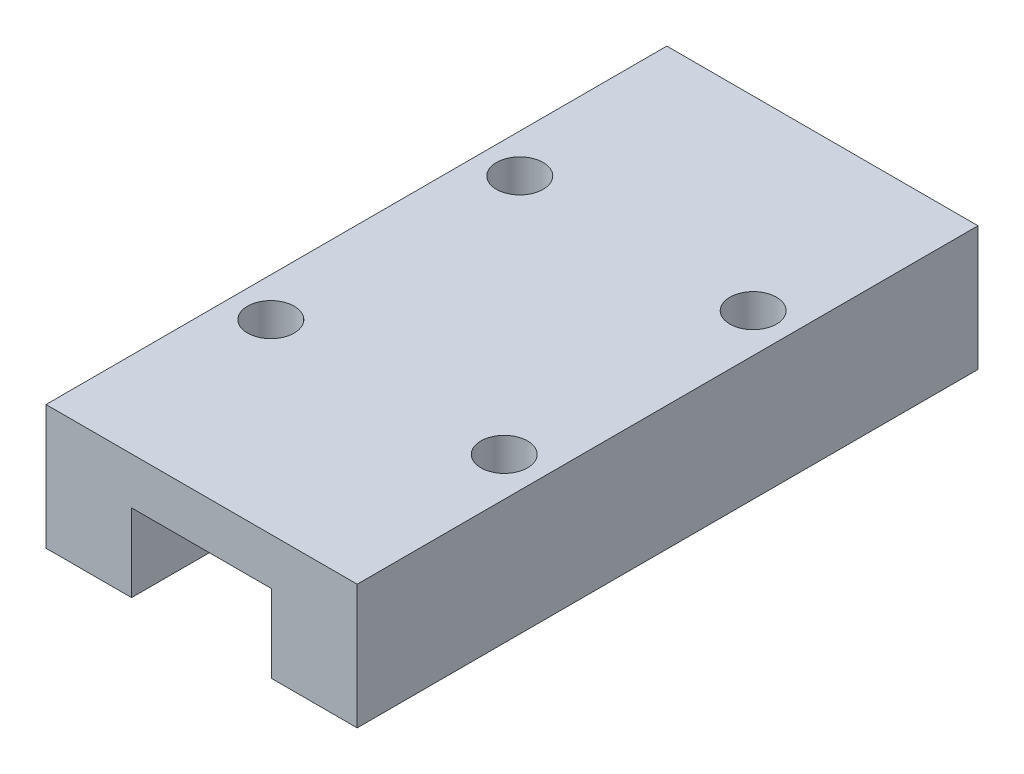
ISO-10303-21;
HEADER;
FILE_DESCRIPTION(('STEP AP214'),'2;1');
FILE_NAME('part.step','',(''),(''),'','','');
FILE_SCHEMA(('AUTOMOTIVE_DESIGN { 1 0 10303 214 1 1 1 1 }'));
ENDSEC;
DATA;
#1=APPLICATION_CONTEXT('core data for automotive mechanical design processes');
#2=APPLICATION_PROTOCOL_DEFINITION('international standard','automotive_design',2000,#1);
#3=PRODUCT_CONTEXT('',#1,'mechanical');
#4=PRODUCT('Part','Part','',(#3));
#5=PRODUCT_RELATED_PRODUCT_CATEGORY('part','',(#4));
#6=PRODUCT_DEFINITION_FORMATION('','',#4);
#7=PRODUCT_DEFINITION_CONTEXT('part definition',#1,'design');
#8=PRODUCT_DEFINITION('design','',#6,#7);
#9=PRODUCT_DEFINITION_SHAPE('','',#8);
#10=(LENGTH_UNIT() NAMED_UNIT(*) SI_UNIT(.MILLI.,.METRE.));
#11=(NAMED_UNIT(*) PLANE_ANGLE_UNIT() SI_UNIT($,.RADIAN.));
#12=(NAMED_UNIT(*) SI_UNIT($,.STERADIAN.) SOLID_ANGLE_UNIT());
#13=UNCERTAINTY_MEASURE_WITH_UNIT(LENGTH_MEASURE(1.E-05),#10,'distance_accuracy_value','');
#14=(GEOMETRIC_REPRESENTATION_CONTEXT(3) GLOBAL_UNCERTAINTY_ASSIGNED_CONTEXT((#13)) GLOBAL_UNIT_ASSIGNED_CONTEXT((#10,
#11,#12)) REPRESENTATION_CONTEXT('',''));
#15=CARTESIAN_POINT('',(0.,0.,0.));
#16=DIRECTION('',(0.,0.,1.));
#17=DIRECTION('',(1.,0.,0.));
#18=AXIS2_PLACEMENT_3D('',#15,#16,#17);
#19=CARTESIAN_POINT('',(0.,0.,39.9));
#20=DIRECTION('',(-1.,0.,0.));
#21=DIRECTION('',(0.,-1.,0.));
#22=AXIS2_PLACEMENT_3D('',#19,#20,#21);
#23=PLANE('',#22);
#24=DIRECTION('',(0.,1.,0.));
#25=VECTOR('',#24,1.);
#26=CARTESIAN_POINT('',(0.,0.,0.));
#27=LINE('',#26,#25);
#28=CARTESIAN_POINT('',(0.,0.,0.));
#29=VERTEX_POINT('',#28);
#30=CARTESIAN_POINT('',(0.,8.,0.));
#31=VERTEX_POINT('',#30);
#32=EDGE_CURVE('E130',#29,#31,#27,.T.);
#33=ORIENTED_EDGE('',*,*,#32,.T.);
#34=DIRECTION('',(0.,0.,-1.));
#35=VECTOR('',#34,1.);
#36=CARTESIAN_POINT('',(0.,8.,39.9));
#37=LINE('',#36,#35);
#38=CARTESIAN_POINT('',(0.,8.,39.9));
#39=VERTEX_POINT('',#38);
#40=EDGE_CURVE('E11',#39,#31,#37,.T.);
#41=ORIENTED_EDGE('',*,*,#40,.F.);
#42=DIRECTION('',(0.,1.,0.));
#43=VECTOR('',#42,1.);
#44=CARTESIAN_POINT('',(0.,0.,39.9));
#45=LINE('',#44,#43);
#46=CARTESIAN_POINT('',(0.,0.,39.9));
#47=VERTEX_POINT('',#46);
#48=EDGE_CURVE('E145',#47,#39,#45,.T.);
#49=ORIENTED_EDGE('',*,*,#48,.F.);
#50=DIRECTION('',(0.,0.,-1.));
#51=VECTOR('',#50,1.);
#52=CARTESIAN_POINT('',(0.,0.,39.9));
#53=LINE('',#52,#51);
#54=EDGE_CURVE('E126',#47,#29,#53,.T.);
#55=ORIENTED_EDGE('',*,*,#54,.T.);
#56=EDGE_LOOP('',(#33,#41,#49,#55));
#57=FACE_BOUND('',#56,.T.);
#58=ADVANCED_FACE('F34',(#57),#23,.F.);
#59=CARTESIAN_POINT('',(0.,8.,39.9));
#60=DIRECTION('',(0.,-1.,0.));
#61=DIRECTION('',(1.,0.,0.));
#62=AXIS2_PLACEMENT_3D('',#59,#60,#61);
#63=PLANE('',#62);
#64=CARTESIAN_POINT('',(-17.5,8.,27.95));
#65=DIRECTION('',(0.,1.,0.));
#66=DIRECTION('',(1.,0.,0.));
#67=AXIS2_PLACEMENT_3D('',#64,#65,#66);
#68=CIRCLE('',#67,1.5);
#69=CARTESIAN_POINT('',(-16.,8.,27.95));
#70=VERTEX_POINT('',#69);
#71=EDGE_CURVE('E196',#70,#70,#68,.T.);
#72=ORIENTED_EDGE('',*,*,#71,.F.);
#73=EDGE_LOOP('',(#72));
#74=FACE_BOUND('',#73,.T.);
#75=CARTESIAN_POINT('',(-2.5,8.,27.95));
#76=DIRECTION('',(0.,1.,0.));
#77=DIRECTION('',(-1.,0.,0.));
#78=AXIS2_PLACEMENT_3D('',#75,#76,#77);
#79=CIRCLE('',#78,1.5);
#80=CARTESIAN_POINT('',(-4.,8.,27.95));
#81=VERTEX_POINT('',#80);
#82=EDGE_CURVE('E190',#81,#81,#79,.T.);
#83=ORIENTED_EDGE('',*,*,#82,.F.);
#84=EDGE_LOOP('',(#83));
#85=FACE_BOUND('',#84,.T.);
#86=CARTESIAN_POINT('',(-2.5,8.,11.95));
#87=DIRECTION('',(0.,1.,0.));
#88=DIRECTION('',(1.,0.,0.));
#89=AXIS2_PLACEMENT_3D('',#86,#87,#88);
#90=CIRCLE('',#89,1.5);
#91=CARTESIAN_POINT('',(-1.,8.,11.95));
#92=VERTEX_POINT('',#91);
#93=EDGE_CURVE('E184',#92,#92,#90,.T.);
#94=ORIENTED_EDGE('',*,*,#93,.F.);
#95=EDGE_LOOP('',(#94));
#96=FACE_BOUND('',#95,.T.);
#97=CARTESIAN_POINT('',(-17.5,8.,11.95));
#98=DIRECTION('',(0.,1.,0.));
#99=DIRECTION('',(-1.,0.,0.));
#100=AXIS2_PLACEMENT_3D('',#97,#98,#99);
#101=CIRCLE('',#100,1.5);
#102=CARTESIAN_POINT('',(-19.,8.,11.95));
#103=VERTEX_POINT('',#102);
#104=EDGE_CURVE('E178',#103,#103,#101,.T.);
#105=ORIENTED_EDGE('',*,*,#104,.F.);
#106=EDGE_LOOP('',(#105));
#107=FACE_BOUND('',#106,.T.);
#108=DIRECTION('',(-1.,0.,0.));
#109=VECTOR('',#108,1.);
#110=CARTESIAN_POINT('',(0.,8.,0.));
#111=LINE('',#110,#109);
#112=CARTESIAN_POINT('',(-20.,8.,0.));
#113=VERTEX_POINT('',#112);
#114=EDGE_CURVE('E133',#31,#113,#111,.T.);
#115=ORIENTED_EDGE('',*,*,#114,.T.);
#116=DIRECTION('',(0.,0.,-1.));
#117=VECTOR('',#116,1.);
#118=CARTESIAN_POINT('',(-20.,8.,39.9));
#119=LINE('',#118,#117);
#120=CARTESIAN_POINT('',(-20.,8.,39.9));
#121=VERTEX_POINT('',#120);
#122=EDGE_CURVE('E42',#121,#113,#119,.T.);
#123=ORIENTED_EDGE('',*,*,#122,.F.);
#124=DIRECTION('',(-1.,0.,0.));
#125=VECTOR('',#124,1.);
#126=CARTESIAN_POINT('',(0.,8.,39.9));
#127=LINE('',#126,#125);
#128=EDGE_CURVE('E93',#39,#121,#127,.T.);
#129=ORIENTED_EDGE('',*,*,#128,.F.);
#130=ORIENTED_EDGE('',*,*,#40,.T.);
#131=EDGE_LOOP('',(#115,#123,#129,#130));
#132=FACE_BOUND('',#131,.T.);
#133=ADVANCED_FACE('F211',(#74,#85,#96,#107,#132),#63,.F.);
#134=CARTESIAN_POINT('',(-20.,0.,39.9));
#135=DIRECTION('',(1.,0.,0.));
#136=DIRECTION('',(0.,0.,-1.));
#137=AXIS2_PLACEMENT_3D('',#134,#135,#136);
#138=PLANE('',#137);
#139=DIRECTION('',(0.,-1.,0.));
#140=VECTOR('',#139,1.);
#141=CARTESIAN_POINT('',(-20.,0.,0.));
#142=LINE('',#141,#140);
#143=CARTESIAN_POINT('',(-20.,0.,0.));
#144=VERTEX_POINT('',#143);
#145=EDGE_CURVE('E136',#113,#144,#142,.T.);
#146=ORIENTED_EDGE('',*,*,#145,.T.);
#147=DIRECTION('',(0.,0.,-1.));
#148=VECTOR('',#147,1.);
#149=CARTESIAN_POINT('',(-20.,0.,39.9));
#150=LINE('',#149,#148);
#151=CARTESIAN_POINT('',(-20.,0.,39.9));
#152=VERTEX_POINT('',#151);
#153=EDGE_CURVE('E152',#152,#144,#150,.T.);
#154=ORIENTED_EDGE('',*,*,#153,.F.);
#155=DIRECTION('',(0.,-1.,0.));
#156=VECTOR('',#155,1.);
#157=CARTESIAN_POINT('',(-20.,0.,39.9));
#158=LINE('',#157,#156);
#159=EDGE_CURVE('E160',#121,#152,#158,.T.);
#160=ORIENTED_EDGE('',*,*,#159,.F.);
#161=ORIENTED_EDGE('',*,*,#122,.T.);
#162=EDGE_LOOP('',(#146,#154,#160,#161));
#163=FACE_BOUND('',#162,.T.);
#164=ADVANCED_FACE('F158',(#163),#138,.F.);
#165=CARTESIAN_POINT('',(-14.5,0.,39.9));
#166=DIRECTION('',(0.,1.,0.));
#167=DIRECTION('',(-1.,0.,0.));
#168=AXIS2_PLACEMENT_3D('',#165,#166,#167);
#169=PLANE('',#168);
#170=DIRECTION('',(1.,0.,0.));
#171=VECTOR('',#170,1.);
#172=CARTESIAN_POINT('',(-14.5,0.,0.));
#173=LINE('',#172,#171);
#174=CARTESIAN_POINT('',(-14.5,0.,0.));
#175=VERTEX_POINT('',#174);
#176=EDGE_CURVE('E138',#144,#175,#173,.T.);
#177=ORIENTED_EDGE('',*,*,#176,.T.);
#178=DIRECTION('',(0.,0.,-1.));
#179=VECTOR('',#178,1.);
#180=CARTESIAN_POINT('',(-14.5,0.,39.9));
#181=LINE('',#180,#179);
#182=CARTESIAN_POINT('',(-14.5,0.,39.9));
#183=VERTEX_POINT('',#182);
#184=EDGE_CURVE('E149',#183,#175,#181,.T.);
#185=ORIENTED_EDGE('',*,*,#184,.F.);
#186=DIRECTION('',(1.,0.,0.));
#187=VECTOR('',#186,1.);
#188=CARTESIAN_POINT('',(-14.5,0.,39.9));
#189=LINE('',#188,#187);
#190=EDGE_CURVE('E172',#152,#183,#189,.T.);
#191=ORIENTED_EDGE('',*,*,#190,.F.);
#192=ORIENTED_EDGE('',*,*,#153,.T.);
#193=EDGE_LOOP('',(#177,#185,#191,#192));
#194=FACE_BOUND('',#193,.T.);
#195=ADVANCED_FACE('F168',(#194),#169,.F.);
#196=CARTESIAN_POINT('',(-14.5,0.,39.9));
#197=DIRECTION('',(-1.,0.,0.));
#198=DIRECTION('',(0.,0.,1.));
#199=AXIS2_PLACEMENT_3D('',#196,#197,#198);
#200=PLANE('',#199);
#201=DIRECTION('',(0.,1.,0.));
#202=VECTOR('',#201,1.);
#203=CARTESIAN_POINT('',(-14.5,0.,0.));
#204=LINE('',#203,#202);
#205=CARTESIAN_POINT('',(-14.5,5.,0.));
#206=VERTEX_POINT('',#205);
#207=EDGE_CURVE('E140',#175,#206,#204,.T.);
#208=ORIENTED_EDGE('',*,*,#207,.T.);
#209=DIRECTION('',(0.,0.,-1.));
#210=VECTOR('',#209,1.);
#211=CARTESIAN_POINT('',(-14.5,5.,39.9));
#212=LINE('',#211,#210);
#213=CARTESIAN_POINT('',(-14.5,5.,39.9));
#214=VERTEX_POINT('',#213);
#215=EDGE_CURVE('E121',#214,#206,#212,.T.);
#216=ORIENTED_EDGE('',*,*,#215,.F.);
#217=DIRECTION('',(0.,1.,0.));
#218=VECTOR('',#217,1.);
#219=CARTESIAN_POINT('',(-14.5,0.,39.9));
#220=LINE('',#219,#218);
#221=EDGE_CURVE('E112',#183,#214,#220,.T.);
#222=ORIENTED_EDGE('',*,*,#221,.F.);
#223=ORIENTED_EDGE('',*,*,#184,.T.);
#224=EDGE_LOOP('',(#208,#216,#222,#223));
#225=FACE_BOUND('',#224,.T.);
#226=ADVANCED_FACE('F171',(#225),#200,.F.);
#227=CARTESIAN_POINT('',(-14.5,5.,39.9));
#228=DIRECTION('',(0.,1.,0.));
#229=DIRECTION('',(-1.,0.,0.));
#230=AXIS2_PLACEMENT_3D('',#227,#228,#229);
#231=PLANE('',#230);
#232=DIRECTION('',(1.,0.,0.));
#233=VECTOR('',#232,1.);
#234=CARTESIAN_POINT('',(-14.5,5.,0.));
#235=LINE('',#234,#233);
#236=CARTESIAN_POINT('',(-5.5,5.,0.));
#237=VERTEX_POINT('',#236);
#238=EDGE_CURVE('E120',#206,#237,#235,.T.);
#239=ORIENTED_EDGE('',*,*,#238,.T.);
#240=DIRECTION('',(0.,0.,-1.));
#241=VECTOR('',#240,1.);
#242=CARTESIAN_POINT('',(-5.5,5.,39.9));
#243=LINE('',#242,#241);
#244=CARTESIAN_POINT('',(-5.5,5.,39.9));
#245=VERTEX_POINT('',#244);
#246=EDGE_CURVE('E117',#245,#237,#243,.T.);
#247=ORIENTED_EDGE('',*,*,#246,.F.);
#248=DIRECTION('',(1.,0.,0.));
#249=VECTOR('',#248,1.);
#250=CARTESIAN_POINT('',(-14.5,5.,39.9));
#251=LINE('',#250,#249);
#252=EDGE_CURVE('E106',#214,#245,#251,.T.);
#253=ORIENTED_EDGE('',*,*,#252,.F.);
#254=ORIENTED_EDGE('',*,*,#215,.T.);
#255=EDGE_LOOP('',(#239,#247,#253,#254));
#256=FACE_BOUND('',#255,.T.);
#257=ADVANCED_FACE('F118',(#256),#231,.F.);
#258=CARTESIAN_POINT('',(-5.5,0.,39.9));
#259=DIRECTION('',(1.,0.,0.));
#260=DIRECTION('',(0.,1.,0.));
#261=AXIS2_PLACEMENT_3D('',#258,#259,#260);
#262=PLANE('',#261);
#263=DIRECTION('',(0.,-1.,0.));
#264=VECTOR('',#263,1.);
#265=CARTESIAN_POINT('',(-5.5,0.,0.));
#266=LINE('',#265,#264);
#267=CARTESIAN_POINT('',(-5.5,0.,0.));
#268=VERTEX_POINT('',#267);
#269=EDGE_CURVE('E79',#237,#268,#266,.T.);
#270=ORIENTED_EDGE('',*,*,#269,.T.);
#271=DIRECTION('',(0.,0.,-1.));
#272=VECTOR('',#271,1.);
#273=CARTESIAN_POINT('',(-5.5,0.,39.9));
#274=LINE('',#273,#272);
#275=CARTESIAN_POINT('',(-5.5,0.,39.9));
#276=VERTEX_POINT('',#275);
#277=EDGE_CURVE('E122',#276,#268,#274,.T.);
#278=ORIENTED_EDGE('',*,*,#277,.F.);
#279=DIRECTION('',(0.,-1.,0.));
#280=VECTOR('',#279,1.);
#281=CARTESIAN_POINT('',(-5.5,0.,39.9));
#282=LINE('',#281,#280);
#283=EDGE_CURVE('E110',#245,#276,#282,.T.);
#284=ORIENTED_EDGE('',*,*,#283,.F.);
#285=ORIENTED_EDGE('',*,*,#246,.T.);
#286=EDGE_LOOP('',(#270,#278,#284,#285));
#287=FACE_BOUND('',#286,.T.);
#288=ADVANCED_FACE('F124',(#287),#262,.F.);
#289=CARTESIAN_POINT('',(0.,0.,39.9));
#290=DIRECTION('',(0.,1.,0.));
#291=DIRECTION('',(-1.,0.,0.));
#292=AXIS2_PLACEMENT_3D('',#289,#290,#291);
#293=PLANE('',#292);
#294=DIRECTION('',(1.,0.,0.));
#295=VECTOR('',#294,1.);
#296=CARTESIAN_POINT('',(0.,0.,0.));
#297=LINE('',#296,#295);
#298=EDGE_CURVE('E85',#268,#29,#297,.T.);
#299=ORIENTED_EDGE('',*,*,#298,.T.);
#300=ORIENTED_EDGE('',*,*,#54,.F.);
#301=DIRECTION('',(1.,0.,0.));
#302=VECTOR('',#301,1.);
#303=CARTESIAN_POINT('',(0.,0.,39.9));
#304=LINE('',#303,#302);
#305=EDGE_CURVE('E50',#276,#47,#304,.T.);
#306=ORIENTED_EDGE('',*,*,#305,.F.);
#307=ORIENTED_EDGE('',*,*,#277,.T.);
#308=EDGE_LOOP('',(#299,#300,#306,#307));
#309=FACE_BOUND('',#308,.T.);
#310=ADVANCED_FACE('F222',(#309),#293,.F.);
#311=CARTESIAN_POINT('',(0.,0.,39.9));
#312=DIRECTION('',(0.,0.,1.));
#313=DIRECTION('',(1.,0.,0.));
#314=AXIS2_PLACEMENT_3D('',#311,#312,#313);
#315=PLANE('',#314);
#316=ORIENTED_EDGE('',*,*,#48,.T.);
#317=ORIENTED_EDGE('',*,*,#128,.T.);
#318=ORIENTED_EDGE('',*,*,#159,.T.);
#319=ORIENTED_EDGE('',*,*,#190,.T.);
#320=ORIENTED_EDGE('',*,*,#221,.T.);
#321=ORIENTED_EDGE('',*,*,#252,.T.);
#322=ORIENTED_EDGE('',*,*,#283,.T.);
#323=ORIENTED_EDGE('',*,*,#305,.T.);
#324=EDGE_LOOP('',(#316,#317,#318,#319,#320,#321,#322,#323));
#325=FACE_BOUND('',#324,.T.);
#326=ADVANCED_FACE('F108',(#325),#315,.T.);
#327=CARTESIAN_POINT('',(0.,0.,0.));
#328=DIRECTION('',(0.,0.,1.));
#329=DIRECTION('',(1.,0.,0.));
#330=AXIS2_PLACEMENT_3D('',#327,#328,#329);
#331=PLANE('',#330);
#332=ORIENTED_EDGE('',*,*,#32,.F.);
#333=ORIENTED_EDGE('',*,*,#298,.F.);
#334=ORIENTED_EDGE('',*,*,#269,.F.);
#335=ORIENTED_EDGE('',*,*,#238,.F.);
#336=ORIENTED_EDGE('',*,*,#207,.F.);
#337=ORIENTED_EDGE('',*,*,#176,.F.);
#338=ORIENTED_EDGE('',*,*,#145,.F.);
#339=ORIENTED_EDGE('',*,*,#114,.F.);
#340=EDGE_LOOP('',(#332,#333,#334,#335,#336,#337,#338,#339));
#341=FACE_BOUND('',#340,.T.);
#342=ADVANCED_FACE('F164',(#341),#331,.F.);
#343=CARTESIAN_POINT('',(-17.5,3.,11.95));
#344=DIRECTION('',(0.,1.,0.));
#345=DIRECTION('',(-1.,0.,0.));
#346=AXIS2_PLACEMENT_3D('',#343,#344,#345);
#347=CYLINDRICAL_SURFACE('',#346,1.5);
#348=CARTESIAN_POINT('',(-17.5,3.,11.95));
#349=DIRECTION('',(0.,1.,0.));
#350=DIRECTION('',(-1.,0.,0.));
#351=AXIS2_PLACEMENT_3D('',#348,#349,#350);
#352=CIRCLE('',#351,1.5);
#353=CARTESIAN_POINT('',(-19.,3.,11.95));
#354=VERTEX_POINT('',#353);
#355=EDGE_CURVE('E134',#354,#354,#352,.T.);
#356=ORIENTED_EDGE('',*,*,#355,.F.);
#357=EDGE_LOOP('',(#356));
#358=FACE_BOUND('',#357,.T.);
#359=ORIENTED_EDGE('',*,*,#104,.T.);
#360=EDGE_LOOP('',(#359));
#361=FACE_BOUND('',#360,.T.);
#362=ADVANCED_FACE('F286',(#358,#361),#347,.F.);
#363=CARTESIAN_POINT('',(-17.5,3.,11.95));
#364=DIRECTION('',(0.,1.,0.));
#365=DIRECTION('',(-1.,0.,0.));
#366=AXIS2_PLACEMENT_3D('',#363,#364,#365);
#367=PLANE('',#366);
#368=ORIENTED_EDGE('',*,*,#355,.T.);
#369=EDGE_LOOP('',(#368));
#370=FACE_BOUND('',#369,.T.);
#371=ADVANCED_FACE('F294',(#370),#367,.T.);
#372=CARTESIAN_POINT('',(-2.5,3.,11.95));
#373=DIRECTION('',(0.,1.,0.));
#374=DIRECTION('',(-1.,0.,0.));
#375=AXIS2_PLACEMENT_3D('',#372,#373,#374);
#376=CYLINDRICAL_SURFACE('',#375,1.5);
#377=CARTESIAN_POINT('',(-2.5,3.,11.95));
#378=DIRECTION('',(0.,1.,0.));
#379=DIRECTION('',(1.,0.,0.));
#380=AXIS2_PLACEMENT_3D('',#377,#378,#379);
#381=CIRCLE('',#380,1.5);
#382=CARTESIAN_POINT('',(-1.,3.,11.95));
#383=VERTEX_POINT('',#382);
#384=EDGE_CURVE('E181',#383,#383,#381,.T.);
#385=ORIENTED_EDGE('',*,*,#384,.F.);
#386=EDGE_LOOP('',(#385));
#387=FACE_BOUND('',#386,.T.);
#388=ORIENTED_EDGE('',*,*,#93,.T.);
#389=EDGE_LOOP('',(#388));
#390=FACE_BOUND('',#389,.T.);
#391=ADVANCED_FACE('F301',(#387,#390),#376,.F.);
#392=CARTESIAN_POINT('',(-2.5,3.,11.95));
#393=DIRECTION('',(0.,-1.,0.));
#394=DIRECTION('',(1.,0.,0.));
#395=AXIS2_PLACEMENT_3D('',#392,#393,#394);
#396=PLANE('',#395);
#397=ORIENTED_EDGE('',*,*,#384,.T.);
#398=EDGE_LOOP('',(#397));
#399=FACE_BOUND('',#398,.T.);
#400=ADVANCED_FACE('F309',(#399),#396,.F.);
#401=CARTESIAN_POINT('',(-2.5,3.,27.95));
#402=DIRECTION('',(0.,1.,0.));
#403=DIRECTION('',(-1.,0.,0.));
#404=AXIS2_PLACEMENT_3D('',#401,#402,#403);
#405=CYLINDRICAL_SURFACE('',#404,1.5);
#406=CARTESIAN_POINT('',(-2.5,3.,27.95));
#407=DIRECTION('',(0.,1.,0.));
#408=DIRECTION('',(-1.,0.,0.));
#409=AXIS2_PLACEMENT_3D('',#406,#407,#408);
#410=CIRCLE('',#409,1.5);
#411=CARTESIAN_POINT('',(-4.,3.,27.95));
#412=VERTEX_POINT('',#411);
#413=EDGE_CURVE('E187',#412,#412,#410,.T.);
#414=ORIENTED_EDGE('',*,*,#413,.F.);
#415=EDGE_LOOP('',(#414));
#416=FACE_BOUND('',#415,.T.);
#417=ORIENTED_EDGE('',*,*,#82,.T.);
#418=EDGE_LOOP('',(#417));
#419=FACE_BOUND('',#418,.T.);
#420=ADVANCED_FACE('F317',(#416,#419),#405,.F.);
#421=CARTESIAN_POINT('',(-2.5,3.,27.95));
#422=DIRECTION('',(0.,1.,0.));
#423=DIRECTION('',(-1.,0.,0.));
#424=AXIS2_PLACEMENT_3D('',#421,#422,#423);
#425=PLANE('',#424);
#426=ORIENTED_EDGE('',*,*,#413,.T.);
#427=EDGE_LOOP('',(#426));
#428=FACE_BOUND('',#427,.T.);
#429=ADVANCED_FACE('F207',(#428),#425,.T.);
#430=CARTESIAN_POINT('',(-17.5,3.,27.95));
#431=DIRECTION('',(0.,1.,0.));
#432=DIRECTION('',(-1.,0.,0.));
#433=AXIS2_PLACEMENT_3D('',#430,#431,#432);
#434=CYLINDRICAL_SURFACE('',#433,1.5);
#435=CARTESIAN_POINT('',(-17.5,3.,27.95));
#436=DIRECTION('',(0.,1.,0.));
#437=DIRECTION('',(1.,0.,0.));
#438=AXIS2_PLACEMENT_3D('',#435,#436,#437);
#439=CIRCLE('',#438,1.5);
#440=CARTESIAN_POINT('',(-16.,3.,27.95));
#441=VERTEX_POINT('',#440);
#442=EDGE_CURVE('E193',#441,#441,#439,.T.);
#443=ORIENTED_EDGE('',*,*,#442,.F.);
#444=EDGE_LOOP('',(#443));
#445=FACE_BOUND('',#444,.T.);
#446=ORIENTED_EDGE('',*,*,#71,.T.);
#447=EDGE_LOOP('',(#446));
#448=FACE_BOUND('',#447,.T.);
#449=ADVANCED_FACE('F204',(#445,#448),#434,.F.);
#450=CARTESIAN_POINT('',(-17.5,3.,27.95));
#451=DIRECTION('',(0.,-1.,0.));
#452=DIRECTION('',(1.,0.,0.));
#453=AXIS2_PLACEMENT_3D('',#450,#451,#452);
#454=PLANE('',#453);
#455=ORIENTED_EDGE('',*,*,#442,.T.);
#456=EDGE_LOOP('',(#455));
#457=FACE_BOUND('',#456,.T.);
#458=ADVANCED_FACE('F202',(#457),#454,.F.);
#459=CLOSED_SHELL('',(#58,#133,#164,#195,#226,#257,#288,#310,#326,#342,#362,#371,#391,#400,#420,
#429,#449,#458));
#460=MANIFOLD_SOLID_BREP('B2',#459);
#461=ADVANCED_BREP_SHAPE_REPRESENTATION('',(#18,#460),#14);
#462=SHAPE_DEFINITION_REPRESENTATION(#9,#461);
ENDSEC;
END-ISO-10303-21;
